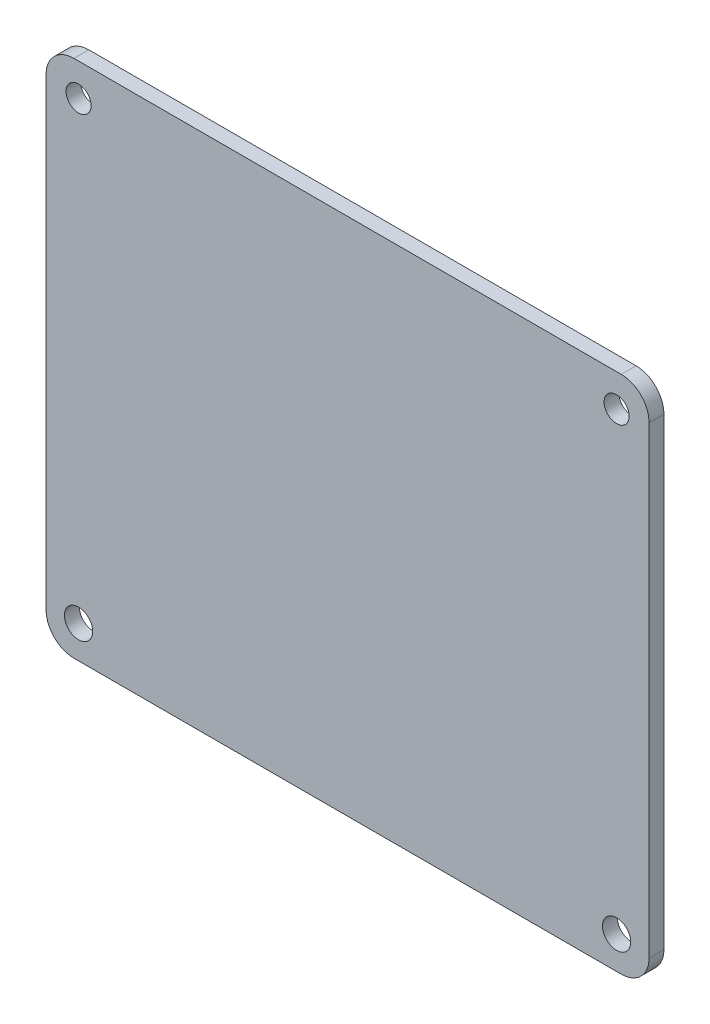
ISO-10303-21;
HEADER;
FILE_DESCRIPTION(('STEP AP214'),'2;1');
FILE_NAME('part.step','',(''),(''),'','','');
FILE_SCHEMA(('AUTOMOTIVE_DESIGN { 1 0 10303 214 1 1 1 1 }'));
ENDSEC;
DATA;
#1=APPLICATION_CONTEXT('core data for automotive mechanical design processes');
#2=APPLICATION_PROTOCOL_DEFINITION('international standard','automotive_design',2000,#1);
#3=PRODUCT_CONTEXT('',#1,'mechanical');
#4=PRODUCT('Part','Part','',(#3));
#5=PRODUCT_RELATED_PRODUCT_CATEGORY('part','',(#4));
#6=PRODUCT_DEFINITION_FORMATION('','',#4);
#7=PRODUCT_DEFINITION_CONTEXT('part definition',#1,'design');
#8=PRODUCT_DEFINITION('design','',#6,#7);
#9=PRODUCT_DEFINITION_SHAPE('','',#8);
#10=(LENGTH_UNIT() NAMED_UNIT(*) SI_UNIT(.MILLI.,.METRE.));
#11=(NAMED_UNIT(*) PLANE_ANGLE_UNIT() SI_UNIT($,.RADIAN.));
#12=(NAMED_UNIT(*) SI_UNIT($,.STERADIAN.) SOLID_ANGLE_UNIT());
#13=UNCERTAINTY_MEASURE_WITH_UNIT(LENGTH_MEASURE(1.E-05),#10,'distance_accuracy_value','');
#14=(GEOMETRIC_REPRESENTATION_CONTEXT(3) GLOBAL_UNCERTAINTY_ASSIGNED_CONTEXT((#13)) GLOBAL_UNIT_ASSIGNED_CONTEXT((#10,
#11,#12)) REPRESENTATION_CONTEXT('',''));
#15=CARTESIAN_POINT('',(0.,0.,0.));
#16=DIRECTION('',(0.,0.,1.));
#17=DIRECTION('',(1.,0.,0.));
#18=AXIS2_PLACEMENT_3D('',#15,#16,#17);
#19=CARTESIAN_POINT('',(-39.5,25.,1.6));
#20=DIRECTION('',(0.,0.,1.));
#21=DIRECTION('',(1.,0.,0.));
#22=AXIS2_PLACEMENT_3D('',#19,#20,#21);
#23=PLANE('',#22);
#24=CARTESIAN_POINT('',(19.,-24.5,1.6));
#25=DIRECTION('',(0.,0.,1.));
#26=DIRECTION('',(1.,0.,0.));
#27=AXIS2_PLACEMENT_3D('',#24,#25,#26);
#28=CIRCLE('',#27,1.524);
#29=CARTESIAN_POINT('',(20.524,-24.5,1.6));
#30=VERTEX_POINT('',#29);
#31=EDGE_CURVE('E192',#30,#30,#28,.T.);
#32=ORIENTED_EDGE('',*,*,#31,.F.);
#33=EDGE_LOOP('',(#32));
#34=FACE_BOUND('',#33,.T.);
#35=CARTESIAN_POINT('',(-39.,24.5,1.6));
#36=DIRECTION('',(0.,0.,1.));
#37=DIRECTION('',(1.,0.,0.));
#38=AXIS2_PLACEMENT_3D('',#35,#36,#37);
#39=CIRCLE('',#38,1.35);
#40=CARTESIAN_POINT('',(-37.65,24.5,1.6));
#41=VERTEX_POINT('',#40);
#42=EDGE_CURVE('E138',#41,#41,#39,.T.);
#43=ORIENTED_EDGE('',*,*,#42,.F.);
#44=EDGE_LOOP('',(#43));
#45=FACE_BOUND('',#44,.T.);
#46=CARTESIAN_POINT('',(-39.5,25.,1.6));
#47=DIRECTION('',(0.,0.,1.));
#48=DIRECTION('',(1.,0.,0.));
#49=AXIS2_PLACEMENT_3D('',#46,#47,#48);
#50=CIRCLE('',#49,3.);
#51=CARTESIAN_POINT('',(-39.5,28.,1.6));
#52=VERTEX_POINT('',#51);
#53=CARTESIAN_POINT('',(-42.5,25.,1.6));
#54=VERTEX_POINT('',#53);
#55=EDGE_CURVE('E149',#52,#54,#50,.T.);
#56=ORIENTED_EDGE('',*,*,#55,.T.);
#57=DIRECTION('',(0.,-1.,0.));
#58=VECTOR('',#57,1.);
#59=CARTESIAN_POINT('',(-42.5,25.,1.6));
#60=LINE('',#59,#58);
#61=CARTESIAN_POINT('',(-42.5,-25.,1.6));
#62=VERTEX_POINT('',#61);
#63=EDGE_CURVE('E97',#54,#62,#60,.T.);
#64=ORIENTED_EDGE('',*,*,#63,.T.);
#65=CARTESIAN_POINT('',(-39.5,-25.,1.6));
#66=DIRECTION('',(0.,0.,1.));
#67=DIRECTION('',(1.,0.,0.));
#68=AXIS2_PLACEMENT_3D('',#65,#66,#67);
#69=CIRCLE('',#68,3.);
#70=CARTESIAN_POINT('',(-39.5,-28.,1.6));
#71=VERTEX_POINT('',#70);
#72=EDGE_CURVE('E164',#62,#71,#69,.T.);
#73=ORIENTED_EDGE('',*,*,#72,.T.);
#74=DIRECTION('',(1.,0.,0.));
#75=VECTOR('',#74,1.);
#76=CARTESIAN_POINT('',(-39.5,-28.,1.6));
#77=LINE('',#76,#75);
#78=CARTESIAN_POINT('',(19.5,-28.,1.6));
#79=VERTEX_POINT('',#78);
#80=EDGE_CURVE('E177',#71,#79,#77,.T.);
#81=ORIENTED_EDGE('',*,*,#80,.T.);
#82=CARTESIAN_POINT('',(19.5,-25.,1.6));
#83=DIRECTION('',(0.,0.,1.));
#84=DIRECTION('',(-1.,0.,0.));
#85=AXIS2_PLACEMENT_3D('',#82,#83,#84);
#86=CIRCLE('',#85,3.);
#87=CARTESIAN_POINT('',(22.5,-25.,1.6));
#88=VERTEX_POINT('',#87);
#89=EDGE_CURVE('E116',#79,#88,#86,.T.);
#90=ORIENTED_EDGE('',*,*,#89,.T.);
#91=DIRECTION('',(0.,1.,0.));
#92=VECTOR('',#91,1.);
#93=CARTESIAN_POINT('',(22.5,25.,1.6));
#94=LINE('',#93,#92);
#95=CARTESIAN_POINT('',(22.5,25.,1.6));
#96=VERTEX_POINT('',#95);
#97=EDGE_CURVE('E110',#88,#96,#94,.T.);
#98=ORIENTED_EDGE('',*,*,#97,.T.);
#99=CARTESIAN_POINT('',(19.5,25.,1.6));
#100=DIRECTION('',(0.,0.,1.));
#101=DIRECTION('',(1.,0.,0.));
#102=AXIS2_PLACEMENT_3D('',#99,#100,#101);
#103=CIRCLE('',#102,3.);
#104=CARTESIAN_POINT('',(19.5,28.,1.6));
#105=VERTEX_POINT('',#104);
#106=EDGE_CURVE('E114',#96,#105,#103,.T.);
#107=ORIENTED_EDGE('',*,*,#106,.T.);
#108=DIRECTION('',(-1.,0.,0.));
#109=VECTOR('',#108,1.);
#110=CARTESIAN_POINT('',(19.5,28.,1.6));
#111=LINE('',#110,#109);
#112=EDGE_CURVE('E54',#105,#52,#111,.T.);
#113=ORIENTED_EDGE('',*,*,#112,.T.);
#114=EDGE_LOOP('',(#56,#64,#73,#81,#90,#98,#107,#113));
#115=FACE_BOUND('',#114,.T.);
#116=CARTESIAN_POINT('',(-39.,-24.5,1.6));
#117=DIRECTION('',(0.,0.,1.));
#118=DIRECTION('',(1.,0.,0.));
#119=AXIS2_PLACEMENT_3D('',#116,#117,#118);
#120=CIRCLE('',#119,1.524);
#121=CARTESIAN_POINT('',(-37.476,-24.5,1.6));
#122=VERTEX_POINT('',#121);
#123=EDGE_CURVE('E186',#122,#122,#120,.T.);
#124=ORIENTED_EDGE('',*,*,#123,.F.);
#125=EDGE_LOOP('',(#124));
#126=FACE_BOUND('',#125,.T.);
#127=CARTESIAN_POINT('',(19.,24.5,1.6));
#128=DIRECTION('',(0.,0.,1.));
#129=DIRECTION('',(1.,0.,0.));
#130=AXIS2_PLACEMENT_3D('',#127,#128,#129);
#131=CIRCLE('',#130,1.35);
#132=CARTESIAN_POINT('',(20.35,24.5,1.6));
#133=VERTEX_POINT('',#132);
#134=EDGE_CURVE('E198',#133,#133,#131,.T.);
#135=ORIENTED_EDGE('',*,*,#134,.F.);
#136=EDGE_LOOP('',(#135));
#137=FACE_BOUND('',#136,.T.);
#138=ADVANCED_FACE('F37',(#34,#45,#115,#126,#137),#23,.T.);
#139=CARTESIAN_POINT('',(-39.5,25.,0.));
#140=DIRECTION('',(0.,0.,1.));
#141=DIRECTION('',(1.,0.,0.));
#142=AXIS2_PLACEMENT_3D('',#139,#140,#141);
#143=PLANE('',#142);
#144=CARTESIAN_POINT('',(-39.5,25.,0.));
#145=DIRECTION('',(0.,0.,1.));
#146=DIRECTION('',(1.,0.,0.));
#147=AXIS2_PLACEMENT_3D('',#144,#145,#146);
#148=CIRCLE('',#147,3.);
#149=CARTESIAN_POINT('',(-39.5,28.,0.));
#150=VERTEX_POINT('',#149);
#151=CARTESIAN_POINT('',(-42.5,25.,0.));
#152=VERTEX_POINT('',#151);
#153=EDGE_CURVE('E134',#150,#152,#148,.T.);
#154=ORIENTED_EDGE('',*,*,#153,.F.);
#155=DIRECTION('',(-1.,0.,0.));
#156=VECTOR('',#155,1.);
#157=CARTESIAN_POINT('',(19.5,28.,0.));
#158=LINE('',#157,#156);
#159=CARTESIAN_POINT('',(19.5,28.,0.));
#160=VERTEX_POINT('',#159);
#161=EDGE_CURVE('E89',#160,#150,#158,.T.);
#162=ORIENTED_EDGE('',*,*,#161,.F.);
#163=CARTESIAN_POINT('',(19.5,25.,0.));
#164=DIRECTION('',(0.,0.,1.));
#165=DIRECTION('',(1.,0.,0.));
#166=AXIS2_PLACEMENT_3D('',#163,#164,#165);
#167=CIRCLE('',#166,3.);
#168=CARTESIAN_POINT('',(22.5,25.,0.));
#169=VERTEX_POINT('',#168);
#170=EDGE_CURVE('E83',#169,#160,#167,.T.);
#171=ORIENTED_EDGE('',*,*,#170,.F.);
#172=DIRECTION('',(0.,1.,0.));
#173=VECTOR('',#172,1.);
#174=CARTESIAN_POINT('',(22.5,25.,0.));
#175=LINE('',#174,#173);
#176=CARTESIAN_POINT('',(22.5,-25.,0.));
#177=VERTEX_POINT('',#176);
#178=EDGE_CURVE('E124',#177,#169,#175,.T.);
#179=ORIENTED_EDGE('',*,*,#178,.F.);
#180=CARTESIAN_POINT('',(19.5,-25.,0.));
#181=DIRECTION('',(0.,0.,1.));
#182=DIRECTION('',(-1.,0.,0.));
#183=AXIS2_PLACEMENT_3D('',#180,#181,#182);
#184=CIRCLE('',#183,3.);
#185=CARTESIAN_POINT('',(19.5,-28.,0.));
#186=VERTEX_POINT('',#185);
#187=EDGE_CURVE('E144',#186,#177,#184,.T.);
#188=ORIENTED_EDGE('',*,*,#187,.F.);
#189=DIRECTION('',(1.,0.,0.));
#190=VECTOR('',#189,1.);
#191=CARTESIAN_POINT('',(-39.5,-28.,0.));
#192=LINE('',#191,#190);
#193=CARTESIAN_POINT('',(-39.5,-28.,0.));
#194=VERTEX_POINT('',#193);
#195=EDGE_CURVE('E142',#194,#186,#192,.T.);
#196=ORIENTED_EDGE('',*,*,#195,.F.);
#197=CARTESIAN_POINT('',(-39.5,-25.,0.));
#198=DIRECTION('',(0.,0.,1.));
#199=DIRECTION('',(1.,0.,0.));
#200=AXIS2_PLACEMENT_3D('',#197,#198,#199);
#201=CIRCLE('',#200,3.);
#202=CARTESIAN_POINT('',(-42.5,-25.,0.));
#203=VERTEX_POINT('',#202);
#204=EDGE_CURVE('E140',#203,#194,#201,.T.);
#205=ORIENTED_EDGE('',*,*,#204,.F.);
#206=DIRECTION('',(0.,-1.,0.));
#207=VECTOR('',#206,1.);
#208=CARTESIAN_POINT('',(-42.5,25.,0.));
#209=LINE('',#208,#207);
#210=EDGE_CURVE('E137',#152,#203,#209,.T.);
#211=ORIENTED_EDGE('',*,*,#210,.F.);
#212=EDGE_LOOP('',(#154,#162,#171,#179,#188,#196,#205,#211));
#213=FACE_BOUND('',#212,.T.);
#214=CARTESIAN_POINT('',(-39.,24.5,0.));
#215=DIRECTION('',(0.,0.,1.));
#216=DIRECTION('',(1.,0.,0.));
#217=AXIS2_PLACEMENT_3D('',#214,#215,#216);
#218=CIRCLE('',#217,1.35);
#219=CARTESIAN_POINT('',(-37.65,24.5,0.));
#220=VERTEX_POINT('',#219);
#221=EDGE_CURVE('E183',#220,#220,#218,.T.);
#222=ORIENTED_EDGE('',*,*,#221,.T.);
#223=EDGE_LOOP('',(#222));
#224=FACE_BOUND('',#223,.T.);
#225=CARTESIAN_POINT('',(-39.,-24.5,0.));
#226=DIRECTION('',(0.,0.,1.));
#227=DIRECTION('',(1.,0.,0.));
#228=AXIS2_PLACEMENT_3D('',#225,#226,#227);
#229=CIRCLE('',#228,1.524);
#230=CARTESIAN_POINT('',(-37.476,-24.5,0.));
#231=VERTEX_POINT('',#230);
#232=EDGE_CURVE('E189',#231,#231,#229,.T.);
#233=ORIENTED_EDGE('',*,*,#232,.T.);
#234=EDGE_LOOP('',(#233));
#235=FACE_BOUND('',#234,.T.);
#236=CARTESIAN_POINT('',(19.,-24.5,0.));
#237=DIRECTION('',(0.,0.,1.));
#238=DIRECTION('',(1.,0.,0.));
#239=AXIS2_PLACEMENT_3D('',#236,#237,#238);
#240=CIRCLE('',#239,1.524);
#241=CARTESIAN_POINT('',(20.524,-24.5,0.));
#242=VERTEX_POINT('',#241);
#243=EDGE_CURVE('E195',#242,#242,#240,.T.);
#244=ORIENTED_EDGE('',*,*,#243,.T.);
#245=EDGE_LOOP('',(#244));
#246=FACE_BOUND('',#245,.T.);
#247=CARTESIAN_POINT('',(19.,24.5,0.));
#248=DIRECTION('',(0.,0.,1.));
#249=DIRECTION('',(1.,0.,0.));
#250=AXIS2_PLACEMENT_3D('',#247,#248,#249);
#251=CIRCLE('',#250,1.35);
#252=CARTESIAN_POINT('',(20.35,24.5,0.));
#253=VERTEX_POINT('',#252);
#254=EDGE_CURVE('E201',#253,#253,#251,.T.);
#255=ORIENTED_EDGE('',*,*,#254,.T.);
#256=EDGE_LOOP('',(#255));
#257=FACE_BOUND('',#256,.T.);
#258=ADVANCED_FACE('F168',(#213,#224,#235,#246,#257),#143,.F.);
#259=CARTESIAN_POINT('',(-39.5,25.,1.6));
#260=DIRECTION('',(0.,0.,-1.));
#261=DIRECTION('',(-1.,0.,0.));
#262=AXIS2_PLACEMENT_3D('',#259,#260,#261);
#263=CYLINDRICAL_SURFACE('',#262,3.);
#264=ORIENTED_EDGE('',*,*,#153,.T.);
#265=DIRECTION('',(0.,0.,-1.));
#266=VECTOR('',#265,1.);
#267=CARTESIAN_POINT('',(-42.5,25.,1.6));
#268=LINE('',#267,#266);
#269=EDGE_CURVE('E11',#54,#152,#268,.T.);
#270=ORIENTED_EDGE('',*,*,#269,.F.);
#271=ORIENTED_EDGE('',*,*,#55,.F.);
#272=DIRECTION('',(0.,0.,-1.));
#273=VECTOR('',#272,1.);
#274=CARTESIAN_POINT('',(-39.5,28.,1.6));
#275=LINE('',#274,#273);
#276=EDGE_CURVE('E130',#52,#150,#275,.T.);
#277=ORIENTED_EDGE('',*,*,#276,.T.);
#278=EDGE_LOOP('',(#264,#270,#271,#277));
#279=FACE_BOUND('',#278,.T.);
#280=ADVANCED_FACE('F39',(#279),#263,.T.);
#281=CARTESIAN_POINT('',(-42.5,25.,1.6));
#282=DIRECTION('',(1.,0.,0.));
#283=DIRECTION('',(0.,1.,0.));
#284=AXIS2_PLACEMENT_3D('',#281,#282,#283);
#285=PLANE('',#284);
#286=ORIENTED_EDGE('',*,*,#210,.T.);
#287=DIRECTION('',(0.,0.,-1.));
#288=VECTOR('',#287,1.);
#289=CARTESIAN_POINT('',(-42.5,-25.,1.6));
#290=LINE('',#289,#288);
#291=EDGE_CURVE('E46',#62,#203,#290,.T.);
#292=ORIENTED_EDGE('',*,*,#291,.F.);
#293=ORIENTED_EDGE('',*,*,#63,.F.);
#294=ORIENTED_EDGE('',*,*,#269,.T.);
#295=EDGE_LOOP('',(#286,#292,#293,#294));
#296=FACE_BOUND('',#295,.T.);
#297=ADVANCED_FACE('F235',(#296),#285,.F.);
#298=CARTESIAN_POINT('',(-39.5,-25.,1.6));
#299=DIRECTION('',(0.,0.,-1.));
#300=DIRECTION('',(-1.,0.,0.));
#301=AXIS2_PLACEMENT_3D('',#298,#299,#300);
#302=CYLINDRICAL_SURFACE('',#301,3.);
#303=ORIENTED_EDGE('',*,*,#204,.T.);
#304=DIRECTION('',(0.,0.,-1.));
#305=VECTOR('',#304,1.);
#306=CARTESIAN_POINT('',(-39.5,-28.,1.6));
#307=LINE('',#306,#305);
#308=EDGE_CURVE('E156',#71,#194,#307,.T.);
#309=ORIENTED_EDGE('',*,*,#308,.F.);
#310=ORIENTED_EDGE('',*,*,#72,.F.);
#311=ORIENTED_EDGE('',*,*,#291,.T.);
#312=EDGE_LOOP('',(#303,#309,#310,#311));
#313=FACE_BOUND('',#312,.T.);
#314=ADVANCED_FACE('F162',(#313),#302,.T.);
#315=CARTESIAN_POINT('',(-39.5,-28.,1.6));
#316=DIRECTION('',(0.,1.,0.));
#317=DIRECTION('',(-1.,0.,0.));
#318=AXIS2_PLACEMENT_3D('',#315,#316,#317);
#319=PLANE('',#318);
#320=ORIENTED_EDGE('',*,*,#195,.T.);
#321=DIRECTION('',(0.,0.,-1.));
#322=VECTOR('',#321,1.);
#323=CARTESIAN_POINT('',(19.5,-28.,1.6));
#324=LINE('',#323,#322);
#325=EDGE_CURVE('E153',#79,#186,#324,.T.);
#326=ORIENTED_EDGE('',*,*,#325,.F.);
#327=ORIENTED_EDGE('',*,*,#80,.F.);
#328=ORIENTED_EDGE('',*,*,#308,.T.);
#329=EDGE_LOOP('',(#320,#326,#327,#328));
#330=FACE_BOUND('',#329,.T.);
#331=ADVANCED_FACE('F173',(#330),#319,.F.);
#332=CARTESIAN_POINT('',(19.5,-25.,1.6));
#333=DIRECTION('',(0.,0.,-1.));
#334=DIRECTION('',(-1.,0.,0.));
#335=AXIS2_PLACEMENT_3D('',#332,#333,#334);
#336=CYLINDRICAL_SURFACE('',#335,3.);
#337=ORIENTED_EDGE('',*,*,#187,.T.);
#338=DIRECTION('',(0.,0.,-1.));
#339=VECTOR('',#338,1.);
#340=CARTESIAN_POINT('',(22.5,-25.,1.6));
#341=LINE('',#340,#339);
#342=EDGE_CURVE('E125',#88,#177,#341,.T.);
#343=ORIENTED_EDGE('',*,*,#342,.F.);
#344=ORIENTED_EDGE('',*,*,#89,.F.);
#345=ORIENTED_EDGE('',*,*,#325,.T.);
#346=EDGE_LOOP('',(#337,#343,#344,#345));
#347=FACE_BOUND('',#346,.T.);
#348=ADVANCED_FACE('F176',(#347),#336,.T.);
#349=CARTESIAN_POINT('',(22.5,25.,1.6));
#350=DIRECTION('',(-1.,0.,0.));
#351=DIRECTION('',(0.,-1.,0.));
#352=AXIS2_PLACEMENT_3D('',#349,#350,#351);
#353=PLANE('',#352);
#354=ORIENTED_EDGE('',*,*,#178,.T.);
#355=DIRECTION('',(0.,0.,-1.));
#356=VECTOR('',#355,1.);
#357=CARTESIAN_POINT('',(22.5,25.,1.6));
#358=LINE('',#357,#356);
#359=EDGE_CURVE('E121',#96,#169,#358,.T.);
#360=ORIENTED_EDGE('',*,*,#359,.F.);
#361=ORIENTED_EDGE('',*,*,#97,.F.);
#362=ORIENTED_EDGE('',*,*,#342,.T.);
#363=EDGE_LOOP('',(#354,#360,#361,#362));
#364=FACE_BOUND('',#363,.T.);
#365=ADVANCED_FACE('F122',(#364),#353,.F.);
#366=CARTESIAN_POINT('',(19.5,25.,1.6));
#367=DIRECTION('',(0.,0.,-1.));
#368=DIRECTION('',(-1.,0.,0.));
#369=AXIS2_PLACEMENT_3D('',#366,#367,#368);
#370=CYLINDRICAL_SURFACE('',#369,3.);
#371=ORIENTED_EDGE('',*,*,#170,.T.);
#372=DIRECTION('',(0.,0.,-1.));
#373=VECTOR('',#372,1.);
#374=CARTESIAN_POINT('',(19.5,28.,1.6));
#375=LINE('',#374,#373);
#376=EDGE_CURVE('E126',#105,#160,#375,.T.);
#377=ORIENTED_EDGE('',*,*,#376,.F.);
#378=ORIENTED_EDGE('',*,*,#106,.F.);
#379=ORIENTED_EDGE('',*,*,#359,.T.);
#380=EDGE_LOOP('',(#371,#377,#378,#379));
#381=FACE_BOUND('',#380,.T.);
#382=ADVANCED_FACE('F128',(#381),#370,.T.);
#383=CARTESIAN_POINT('',(19.5,28.,1.6));
#384=DIRECTION('',(0.,-1.,0.));
#385=DIRECTION('',(0.,0.,-1.));
#386=AXIS2_PLACEMENT_3D('',#383,#384,#385);
#387=PLANE('',#386);
#388=ORIENTED_EDGE('',*,*,#161,.T.);
#389=ORIENTED_EDGE('',*,*,#276,.F.);
#390=ORIENTED_EDGE('',*,*,#112,.F.);
#391=ORIENTED_EDGE('',*,*,#376,.T.);
#392=EDGE_LOOP('',(#388,#389,#390,#391));
#393=FACE_BOUND('',#392,.T.);
#394=ADVANCED_FACE('F223',(#393),#387,.F.);
#395=CARTESIAN_POINT('',(-39.,24.5,1.6));
#396=DIRECTION('',(0.,0.,-1.));
#397=DIRECTION('',(-1.,0.,0.));
#398=AXIS2_PLACEMENT_3D('',#395,#396,#397);
#399=CYLINDRICAL_SURFACE('',#398,1.35);
#400=ORIENTED_EDGE('',*,*,#42,.T.);
#401=EDGE_LOOP('',(#400));
#402=FACE_BOUND('',#401,.T.);
#403=ORIENTED_EDGE('',*,*,#221,.F.);
#404=EDGE_LOOP('',(#403));
#405=FACE_BOUND('',#404,.T.);
#406=ADVANCED_FACE('F220',(#402,#405),#399,.F.);
#407=CARTESIAN_POINT('',(-39.,-24.5,1.6));
#408=DIRECTION('',(0.,0.,-1.));
#409=DIRECTION('',(-1.,0.,0.));
#410=AXIS2_PLACEMENT_3D('',#407,#408,#409);
#411=CYLINDRICAL_SURFACE('',#410,1.524);
#412=ORIENTED_EDGE('',*,*,#123,.T.);
#413=EDGE_LOOP('',(#412));
#414=FACE_BOUND('',#413,.T.);
#415=ORIENTED_EDGE('',*,*,#232,.F.);
#416=EDGE_LOOP('',(#415));
#417=FACE_BOUND('',#416,.T.);
#418=ADVANCED_FACE('F303',(#414,#417),#411,.F.);
#419=CARTESIAN_POINT('',(19.,-24.5,1.6));
#420=DIRECTION('',(0.,0.,-1.));
#421=DIRECTION('',(-1.,0.,0.));
#422=AXIS2_PLACEMENT_3D('',#419,#420,#421);
#423=CYLINDRICAL_SURFACE('',#422,1.524);
#424=ORIENTED_EDGE('',*,*,#31,.T.);
#425=EDGE_LOOP('',(#424));
#426=FACE_BOUND('',#425,.T.);
#427=ORIENTED_EDGE('',*,*,#243,.F.);
#428=EDGE_LOOP('',(#427));
#429=FACE_BOUND('',#428,.T.);
#430=ADVANCED_FACE('F311',(#426,#429),#423,.F.);
#431=CARTESIAN_POINT('',(19.,24.5,1.6));
#432=DIRECTION('',(0.,0.,-1.));
#433=DIRECTION('',(-1.,0.,0.));
#434=AXIS2_PLACEMENT_3D('',#431,#432,#433);
#435=CYLINDRICAL_SURFACE('',#434,1.35);
#436=ORIENTED_EDGE('',*,*,#134,.T.);
#437=EDGE_LOOP('',(#436));
#438=FACE_BOUND('',#437,.T.);
#439=ORIENTED_EDGE('',*,*,#254,.F.);
#440=EDGE_LOOP('',(#439));
#441=FACE_BOUND('',#440,.T.);
#442=ADVANCED_FACE('F207',(#438,#441),#435,.F.);
#443=CLOSED_SHELL('',(#138,#258,#280,#297,#314,#331,#348,#365,#382,#394,#406,#418,#430,#442));
#444=MANIFOLD_SOLID_BREP('B2',#443);
#445=ADVANCED_BREP_SHAPE_REPRESENTATION('',(#18,#444),#14);
#446=SHAPE_DEFINITION_REPRESENTATION(#9,#445);
ENDSEC;
END-ISO-10303-21;
